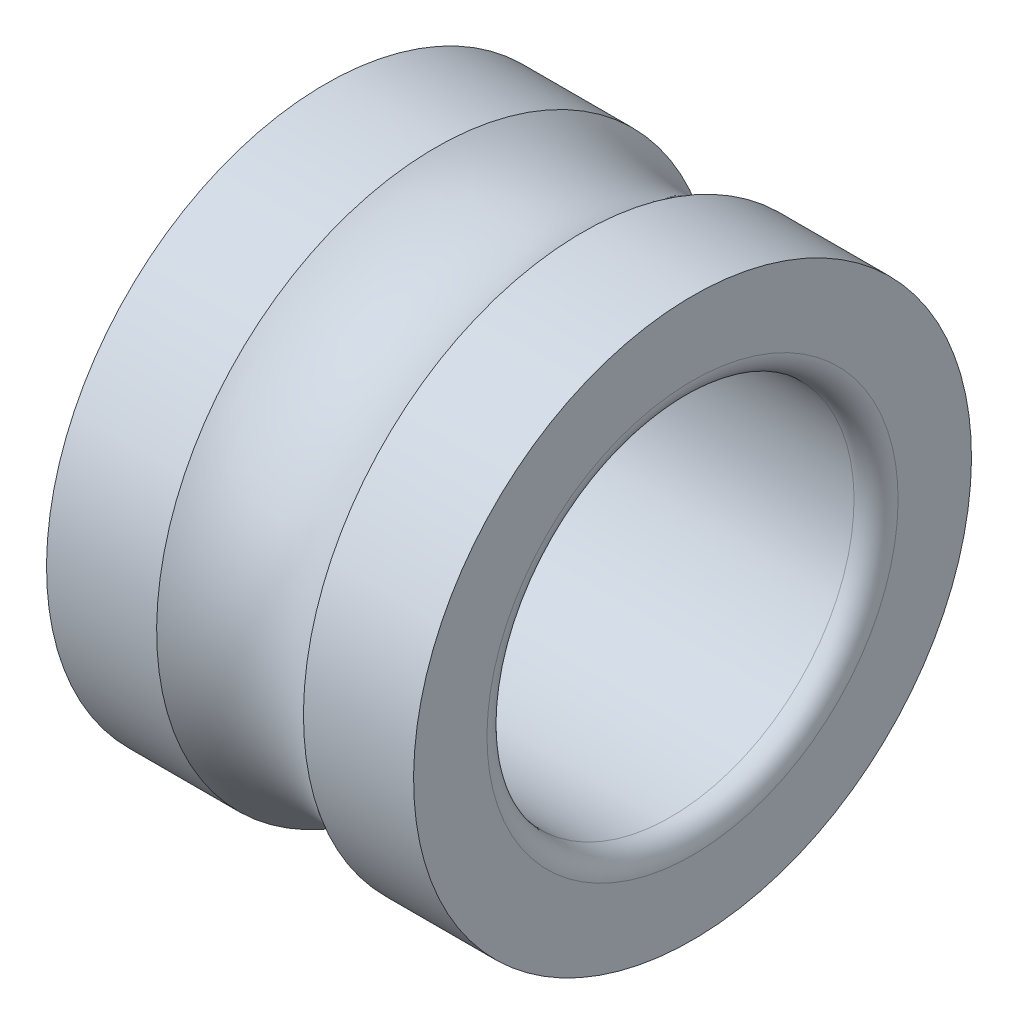
ISO-10303-21;
HEADER;
FILE_DESCRIPTION(('STEP AP214'),'2;1');
FILE_NAME('part.step','',(''),(''),'','','');
FILE_SCHEMA(('AUTOMOTIVE_DESIGN { 1 0 10303 214 1 1 1 1 }'));
ENDSEC;
DATA;
#1=APPLICATION_CONTEXT('core data for automotive mechanical design processes');
#2=APPLICATION_PROTOCOL_DEFINITION('international standard','automotive_design',2000,#1);
#3=PRODUCT_CONTEXT('',#1,'mechanical');
#4=PRODUCT('Part','Part','',(#3));
#5=PRODUCT_RELATED_PRODUCT_CATEGORY('part','',(#4));
#6=PRODUCT_DEFINITION_FORMATION('','',#4);
#7=PRODUCT_DEFINITION_CONTEXT('part definition',#1,'design');
#8=PRODUCT_DEFINITION('design','',#6,#7);
#9=PRODUCT_DEFINITION_SHAPE('','',#8);
#10=(LENGTH_UNIT() NAMED_UNIT(*) SI_UNIT(.MILLI.,.METRE.));
#11=(NAMED_UNIT(*) PLANE_ANGLE_UNIT() SI_UNIT($,.RADIAN.));
#12=(NAMED_UNIT(*) SI_UNIT($,.STERADIAN.) SOLID_ANGLE_UNIT());
#13=UNCERTAINTY_MEASURE_WITH_UNIT(LENGTH_MEASURE(1.E-05),#10,'distance_accuracy_value','');
#14=(GEOMETRIC_REPRESENTATION_CONTEXT(3) GLOBAL_UNCERTAINTY_ASSIGNED_CONTEXT((#13)) GLOBAL_UNIT_ASSIGNED_CONTEXT((#10,
#11,#12)) REPRESENTATION_CONTEXT('',''));
#15=CARTESIAN_POINT('',(0.,0.,0.));
#16=DIRECTION('',(0.,0.,1.));
#17=DIRECTION('',(1.,0.,0.));
#18=AXIS2_PLACEMENT_3D('',#15,#16,#17);
#19=CARTESIAN_POINT('',(1.75,0.,0.));
#20=DIRECTION('',(-1.,0.,0.));
#21=DIRECTION('',(0.,0.5,0.866025403784439));
#22=AXIS2_PLACEMENT_3D('',#19,#20,#21);
#23=CYLINDRICAL_SURFACE('',#22,3.8);
#24=CARTESIAN_POINT('',(1.,0.,0.));
#25=DIRECTION('',(-1.,0.,0.));
#26=DIRECTION('',(0.,0.5,0.866025403784439));
#27=AXIS2_PLACEMENT_3D('',#24,#25,#26);
#28=CIRCLE('',#27,3.8);
#29=CARTESIAN_POINT('',(1.,-1.9,-3.29089653438086));
#30=VERTEX_POINT('',#29);
#31=EDGE_CURVE('E95',#30,#30,#28,.T.);
#32=ORIENTED_EDGE('',*,*,#31,.F.);
#33=DIRECTION('',(1.,0.,0.));
#34=VECTOR('',#33,1.);
#35=CARTESIAN_POINT('',(1.75,-1.9,-3.29089653438086));
#36=LINE('',#35,#34);
#37=CARTESIAN_POINT('',(2.5,-1.9,-3.29089653438086));
#38=VERTEX_POINT('',#37);
#39=EDGE_CURVE('E11',#30,#38,#36,.T.);
#40=ORIENTED_EDGE('',*,*,#39,.T.);
#41=CARTESIAN_POINT('',(2.5,0.,0.));
#42=DIRECTION('',(-1.,0.,0.));
#43=DIRECTION('',(0.,0.5,0.866025403784439));
#44=AXIS2_PLACEMENT_3D('',#41,#42,#43);
#45=CIRCLE('',#44,3.8);
#46=EDGE_CURVE('E28',#38,#38,#45,.T.);
#47=ORIENTED_EDGE('',*,*,#46,.T.);
#48=ORIENTED_EDGE('',*,*,#39,.F.);
#49=EDGE_LOOP('',(#32,#40,#47,#48));
#50=FACE_BOUND('',#49,.T.);
#51=ADVANCED_FACE('F17',(#50),#23,.T.);
#52=CARTESIAN_POINT('',(2.5,1.9,3.29089653438086));
#53=DIRECTION('',(1.,0.,0.));
#54=DIRECTION('',(0.,1.,0.));
#55=AXIS2_PLACEMENT_3D('',#52,#53,#54);
#56=PLANE('',#55);
#57=CARTESIAN_POINT('',(2.5,0.,0.));
#58=DIRECTION('',(-1.,0.,0.));
#59=DIRECTION('',(0.,0.5,0.866025403784439));
#60=AXIS2_PLACEMENT_3D('',#57,#58,#59);
#61=CIRCLE('',#60,2.80000000332807);
#62=CARTESIAN_POINT('',(2.5,-1.40000000166403,-2.42487113347862));
#63=VERTEX_POINT('',#62);
#64=EDGE_CURVE('E89',#63,#63,#61,.T.);
#65=ORIENTED_EDGE('',*,*,#64,.T.);
#66=EDGE_LOOP('',(#65));
#67=FACE_BOUND('',#66,.T.);
#68=ORIENTED_EDGE('',*,*,#46,.F.);
#69=EDGE_LOOP('',(#68));
#70=FACE_BOUND('',#69,.T.);
#71=ADVANCED_FACE('F228',(#67,#70),#56,.T.);
#72=CARTESIAN_POINT('',(2.2,0.,0.));
#73=DIRECTION('',(-1.,0.,0.));
#74=DIRECTION('',(0.,0.5,0.866025403784439));
#75=AXIS2_PLACEMENT_3D('',#72,#73,#74);
#76=TOROIDAL_SURFACE('',#75,2.8,0.3);
#77=ORIENTED_EDGE('',*,*,#64,.F.);
#78=CARTESIAN_POINT('',(2.2,-1.4,-2.42487113059643));
#79=DIRECTION('',(0.,-0.866025403784439,0.5));
#80=DIRECTION('',(0.,-0.5,-0.866025403784439));
#81=AXIS2_PLACEMENT_3D('',#78,#79,#80);
#82=CIRCLE('',#81,0.3);
#83=CARTESIAN_POINT('',(2.2,-1.25,-2.1650635094611));
#84=VERTEX_POINT('',#83);
#85=EDGE_CURVE('E86',#63,#84,#82,.T.);
#86=ORIENTED_EDGE('',*,*,#85,.T.);
#87=CARTESIAN_POINT('',(2.2,0.,0.));
#88=DIRECTION('',(-1.,0.,0.));
#89=DIRECTION('',(0.,0.5,0.866025403784439));
#90=AXIS2_PLACEMENT_3D('',#87,#88,#89);
#91=CIRCLE('',#90,2.5);
#92=EDGE_CURVE('E119',#84,#84,#91,.T.);
#93=ORIENTED_EDGE('',*,*,#92,.T.);
#94=ORIENTED_EDGE('',*,*,#85,.F.);
#95=EDGE_LOOP('',(#77,#86,#93,#94));
#96=FACE_BOUND('',#95,.T.);
#97=ADVANCED_FACE('F219',(#96),#76,.T.);
#98=CARTESIAN_POINT('',(0.,0.,0.));
#99=DIRECTION('',(-1.,0.,0.));
#100=DIRECTION('',(0.,0.5,0.866025403784439));
#101=AXIS2_PLACEMENT_3D('',#98,#99,#100);
#102=CYLINDRICAL_SURFACE('',#101,2.5);
#103=CARTESIAN_POINT('',(-2.2,0.,0.));
#104=DIRECTION('',(-1.,0.,0.));
#105=DIRECTION('',(0.,0.5,0.866025403784439));
#106=AXIS2_PLACEMENT_3D('',#103,#104,#105);
#107=CIRCLE('',#106,2.5);
#108=CARTESIAN_POINT('',(-2.2,-1.25,-2.1650635094611));
#109=VERTEX_POINT('',#108);
#110=EDGE_CURVE('E90',#109,#109,#107,.T.);
#111=ORIENTED_EDGE('',*,*,#110,.T.);
#112=DIRECTION('',(1.,0.,0.));
#113=VECTOR('',#112,1.);
#114=CARTESIAN_POINT('',(0.,-1.25,-2.1650635094611));
#115=LINE('',#114,#113);
#116=EDGE_CURVE('E84',#109,#84,#115,.T.);
#117=ORIENTED_EDGE('',*,*,#116,.T.);
#118=ORIENTED_EDGE('',*,*,#92,.F.);
#119=ORIENTED_EDGE('',*,*,#116,.F.);
#120=EDGE_LOOP('',(#111,#117,#118,#119));
#121=FACE_BOUND('',#120,.T.);
#122=ADVANCED_FACE('F131',(#121),#102,.F.);
#123=CARTESIAN_POINT('',(-2.2,0.,0.));
#124=DIRECTION('',(-1.,0.,0.));
#125=DIRECTION('',(0.,0.5,0.866025403784439));
#126=AXIS2_PLACEMENT_3D('',#123,#124,#125);
#127=TOROIDAL_SURFACE('',#126,2.8,0.3);
#128=ORIENTED_EDGE('',*,*,#110,.F.);
#129=CARTESIAN_POINT('',(-2.2,-1.4,-2.42487113059643));
#130=DIRECTION('',(0.,-0.866025403784439,0.5));
#131=DIRECTION('',(0.,-0.5,-0.866025403784439));
#132=AXIS2_PLACEMENT_3D('',#129,#130,#131);
#133=CIRCLE('',#132,0.3);
#134=CARTESIAN_POINT('',(-2.5,-1.4,-2.42487113059643));
#135=VERTEX_POINT('',#134);
#136=EDGE_CURVE('E93',#109,#135,#133,.T.);
#137=ORIENTED_EDGE('',*,*,#136,.T.);
#138=CARTESIAN_POINT('',(-2.5,0.,0.));
#139=DIRECTION('',(-1.,0.,0.));
#140=DIRECTION('',(0.,0.5,0.866025403784439));
#141=AXIS2_PLACEMENT_3D('',#138,#139,#140);
#142=CIRCLE('',#141,2.8);
#143=EDGE_CURVE('E21',#135,#135,#142,.T.);
#144=ORIENTED_EDGE('',*,*,#143,.T.);
#145=ORIENTED_EDGE('',*,*,#136,.F.);
#146=EDGE_LOOP('',(#128,#137,#144,#145));
#147=FACE_BOUND('',#146,.T.);
#148=ADVANCED_FACE('F136',(#147),#127,.T.);
#149=CARTESIAN_POINT('',(-2.5,1.4,2.42487113059643));
#150=DIRECTION('',(-1.,0.,0.));
#151=DIRECTION('',(0.,0.,1.));
#152=AXIS2_PLACEMENT_3D('',#149,#150,#151);
#153=PLANE('',#152);
#154=ORIENTED_EDGE('',*,*,#143,.F.);
#155=EDGE_LOOP('',(#154));
#156=FACE_BOUND('',#155,.T.);
#157=CARTESIAN_POINT('',(-2.5,0.,0.));
#158=DIRECTION('',(-1.,0.,0.));
#159=DIRECTION('',(0.,0.5,0.866025403784439));
#160=AXIS2_PLACEMENT_3D('',#157,#158,#159);
#161=CIRCLE('',#160,3.8);
#162=CARTESIAN_POINT('',(-2.5,-1.9,-3.29089653438086));
#163=VERTEX_POINT('',#162);
#164=EDGE_CURVE('E68',#163,#163,#161,.T.);
#165=ORIENTED_EDGE('',*,*,#164,.T.);
#166=EDGE_LOOP('',(#165));
#167=FACE_BOUND('',#166,.T.);
#168=ADVANCED_FACE('F73',(#156,#167),#153,.T.);
#169=CARTESIAN_POINT('',(-1.75,0.,0.));
#170=DIRECTION('',(-1.,0.,0.));
#171=DIRECTION('',(0.,0.5,0.866025403784439));
#172=AXIS2_PLACEMENT_3D('',#169,#170,#171);
#173=CYLINDRICAL_SURFACE('',#172,3.8);
#174=ORIENTED_EDGE('',*,*,#164,.F.);
#175=DIRECTION('',(1.,0.,0.));
#176=VECTOR('',#175,1.);
#177=CARTESIAN_POINT('',(-1.75,-1.9,-3.29089653438086));
#178=LINE('',#177,#176);
#179=CARTESIAN_POINT('',(-1.,-1.9,-3.29089653438086));
#180=VERTEX_POINT('',#179);
#181=EDGE_CURVE('E66',#163,#180,#178,.T.);
#182=ORIENTED_EDGE('',*,*,#181,.T.);
#183=CARTESIAN_POINT('',(-1.,0.,0.));
#184=DIRECTION('',(-1.,0.,0.));
#185=DIRECTION('',(0.,0.5,0.866025403784439));
#186=AXIS2_PLACEMENT_3D('',#183,#184,#185);
#187=CIRCLE('',#186,3.8);
#188=EDGE_CURVE('E70',#180,#180,#187,.T.);
#189=ORIENTED_EDGE('',*,*,#188,.T.);
#190=ORIENTED_EDGE('',*,*,#181,.F.);
#191=EDGE_LOOP('',(#174,#182,#189,#190));
#192=FACE_BOUND('',#191,.T.);
#193=ADVANCED_FACE('F19',(#192),#173,.T.);
#194=CARTESIAN_POINT('',(0.,0.,0.));
#195=DIRECTION('',(-1.,0.,0.));
#196=DIRECTION('',(0.,0.5,0.866025403784439));
#197=AXIS2_PLACEMENT_3D('',#194,#195,#196);
#198=TOROIDAL_SURFACE('',#197,5.31666666666669,1.81666666666669);
#199=ORIENTED_EDGE('',*,*,#31,.T.);
#200=CARTESIAN_POINT('',(0.,-2.65833333333335,-4.60436839678729));
#201=DIRECTION('',(0.,-0.866025403784439,0.5));
#202=DIRECTION('',(0.,-0.5,-0.866025403784439));
#203=AXIS2_PLACEMENT_3D('',#200,#201,#202);
#204=CIRCLE('',#203,1.81666666666669);
#205=EDGE_CURVE('E80',#30,#180,#204,.T.);
#206=ORIENTED_EDGE('',*,*,#205,.T.);
#207=ORIENTED_EDGE('',*,*,#188,.F.);
#208=ORIENTED_EDGE('',*,*,#205,.F.);
#209=EDGE_LOOP('',(#199,#206,#207,#208));
#210=FACE_BOUND('',#209,.T.);
#211=ADVANCED_FACE('F105',(#210),#198,.F.);
#212=CLOSED_SHELL('',(#51,#71,#97,#122,#148,#168,#193,#211));
#213=MANIFOLD_SOLID_BREP('B1',#212);
#214=ADVANCED_BREP_SHAPE_REPRESENTATION('',(#18,#213),#14);
#215=SHAPE_DEFINITION_REPRESENTATION(#9,#214);
ENDSEC;
END-ISO-10303-21;
